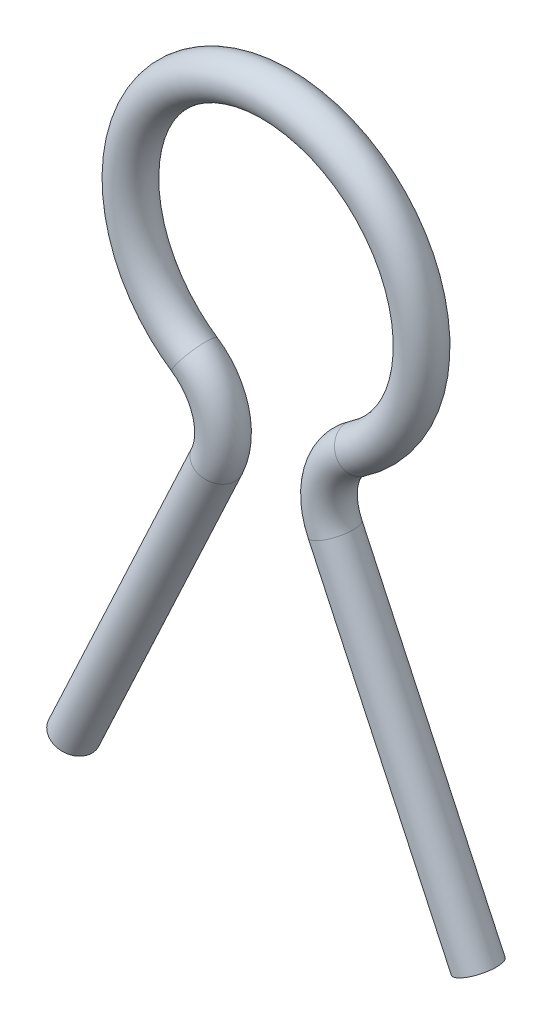
ISO-10303-21;
HEADER;
FILE_DESCRIPTION(('STEP AP214'),'2;1');
FILE_NAME('part.step','',(''),(''),'','','');
FILE_SCHEMA(('AUTOMOTIVE_DESIGN { 1 0 10303 214 1 1 1 1 }'));
ENDSEC;
DATA;
#1=APPLICATION_CONTEXT('core data for automotive mechanical design processes');
#2=APPLICATION_PROTOCOL_DEFINITION('international standard','automotive_design',2000,#1);
#3=PRODUCT_CONTEXT('',#1,'mechanical');
#4=PRODUCT('Part','Part','',(#3));
#5=PRODUCT_RELATED_PRODUCT_CATEGORY('part','',(#4));
#6=PRODUCT_DEFINITION_FORMATION('','',#4);
#7=PRODUCT_DEFINITION_CONTEXT('part definition',#1,'design');
#8=PRODUCT_DEFINITION('design','',#6,#7);
#9=PRODUCT_DEFINITION_SHAPE('','',#8);
#10=(LENGTH_UNIT() NAMED_UNIT(*) SI_UNIT(.MILLI.,.METRE.));
#11=(NAMED_UNIT(*) PLANE_ANGLE_UNIT() SI_UNIT($,.RADIAN.));
#12=(NAMED_UNIT(*) SI_UNIT($,.STERADIAN.) SOLID_ANGLE_UNIT());
#13=UNCERTAINTY_MEASURE_WITH_UNIT(LENGTH_MEASURE(1.E-05),#10,'distance_accuracy_value','');
#14=(GEOMETRIC_REPRESENTATION_CONTEXT(3) GLOBAL_UNCERTAINTY_ASSIGNED_CONTEXT((#13)) GLOBAL_UNIT_ASSIGNED_CONTEXT((#10,
#11,#12)) REPRESENTATION_CONTEXT('',''));
#15=CARTESIAN_POINT('',(0.,0.,0.));
#16=DIRECTION('',(0.,0.,1.));
#17=DIRECTION('',(1.,0.,0.));
#18=AXIS2_PLACEMENT_3D('',#15,#16,#17);
#19=CARTESIAN_POINT('',(0.,0.,0.));
#20=DIRECTION('',(-0.422618261740694,0.906307787036652,0.));
#21=DIRECTION('',(-0.906307787036652,-0.422618261740694,0.));
#22=AXIS2_PLACEMENT_3D('',#19,#20,#21);
#23=PLANE('',#22);
#24=CARTESIAN_POINT('',(0.,0.,0.));
#25=DIRECTION('',(-0.422618261740694,0.906307787036652,0.));
#26=DIRECTION('',(-0.906307787036652,-0.422618261740694,0.));
#27=AXIS2_PLACEMENT_3D('',#24,#25,#26);
#28=CIRCLE('',#27,0.7874);
#29=CARTESIAN_POINT('',(-0.71362675151266,-0.332769619294623,0.));
#30=VERTEX_POINT('',#29);
#31=EDGE_CURVE('E54',#30,#30,#28,.T.);
#32=ORIENTED_EDGE('',*,*,#31,.F.);
#33=EDGE_LOOP('',(#32));
#34=FACE_BOUND('',#33,.T.);
#35=ADVANCED_FACE('F32',(#34),#23,.F.);
#36=CARTESIAN_POINT('',(-15.8749999999997,0.,0.));
#37=DIRECTION('',(-0.4226182617407,-0.906307787036649,0.));
#38=DIRECTION('',(0.906307787036649,-0.4226182617407,0.));
#39=AXIS2_PLACEMENT_3D('',#36,#37,#38);
#40=PLANE('',#39);
#41=CARTESIAN_POINT('',(-15.8749999999997,0.,0.));
#42=DIRECTION('',(-0.4226182617407,-0.906307787036649,0.));
#43=DIRECTION('',(0.906307787036649,-0.4226182617407,0.));
#44=AXIS2_PLACEMENT_3D('',#41,#42,#43);
#45=CIRCLE('',#44,0.7874);
#46=CARTESIAN_POINT('',(-15.161373248487,-0.332769619294624,0.));
#47=VERTEX_POINT('',#46);
#48=EDGE_CURVE('E10',#47,#47,#45,.T.);
#49=ORIENTED_EDGE('',*,*,#48,.T.);
#50=EDGE_LOOP('',(#49));
#51=FACE_BOUND('',#50,.T.);
#52=ADVANCED_FACE('F61',(#51),#40,.T.);
#53=CARTESIAN_POINT('',(0.,0.,0.));
#54=DIRECTION('',(-0.422618261740694,0.906307787036652,0.));
#55=DIRECTION('',(-0.906307787036653,-0.422618261740694,0.));
#56=AXIS2_PLACEMENT_3D('',#53,#54,#55);
#57=CYLINDRICAL_SURFACE('',#56,0.7874);
#58=CARTESIAN_POINT('',(-5.62072660589347,12.0536871046309,0.));
#59=DIRECTION('',(-0.422618261740694,0.906307787036652,0.));
#60=DIRECTION('',(-0.906307787036652,-0.422618261740694,0.));
#61=AXIS2_PLACEMENT_3D('',#58,#59,#60);
#62=CIRCLE('',#61,0.7874);
#63=CARTESIAN_POINT('',(-6.33435335740613,11.7209174853363,0.));
#64=VERTEX_POINT('',#63);
#65=EDGE_CURVE('E51',#64,#64,#62,.T.);
#66=ORIENTED_EDGE('',*,*,#65,.F.);
#67=EDGE_LOOP('',(#66));
#68=FACE_BOUND('',#67,.T.);
#69=ORIENTED_EDGE('',*,*,#31,.T.);
#70=EDGE_LOOP('',(#69));
#71=FACE_BOUND('',#70,.T.);
#72=ADVANCED_FACE('F58',(#68,#71),#57,.T.);
#73=CARTESIAN_POINT('',(-3.31870482682037,13.1271374894523,0.));
#74=DIRECTION('',(0.,0.,-1.));
#75=DIRECTION('',(-1.,0.,0.));
#76=AXIS2_PLACEMENT_3D('',#73,#74,#75);
#77=TOROIDAL_SURFACE('',#76,2.54,0.7874);
#78=CARTESIAN_POINT('',(-4.73987257241405,15.2323410992925,0.));
#79=DIRECTION('',(0.828820318834721,0.559514860469953,0.));
#80=DIRECTION('',(-0.559514860469953,0.828820318834721,0.));
#81=AXIS2_PLACEMENT_3D('',#78,#79,#80);
#82=CIRCLE('',#81,0.7874);
#83=CARTESIAN_POINT('',(-5.18043457354809,15.884954218343,0.));
#84=VERTEX_POINT('',#83);
#85=EDGE_CURVE('E46',#84,#84,#82,.T.);
#86=CARTESIAN_POINT('',(-3.31870482682037,13.1271374894523,0.));
#87=DIRECTION('',(0.,0.,-1.));
#88=DIRECTION('',(-1.,0.,0.));
#89=AXIS2_PLACEMENT_3D('',#86,#87,#88);
#90=CIRCLE('',#89,3.3274);
#91=EDGE_CURVE('',#64,#84,#90,.T.);
#92=ORIENTED_EDGE('',*,*,#65,.T.);
#93=ORIENTED_EDGE('',*,*,#85,.F.);
#94=ORIENTED_EDGE('',*,*,#91,.T.);
#95=ORIENTED_EDGE('',*,*,#91,.F.);
#96=EDGE_LOOP('',(#92,#94,#93,#95));
#97=FACE_BOUND('',#96,.T.);
#98=ADVANCED_FACE('F79',(#97),#77,.T.);
#99=CARTESIAN_POINT('',(-7.93749999999981,19.9690492214329,0.));
#100=DIRECTION('',(0.,0.,1.));
#101=DIRECTION('',(1.,0.,0.));
#102=AXIS2_PLACEMENT_3D('',#99,#100,#101);
#103=TOROIDAL_SURFACE('',#102,5.71499999999998,0.7874);
#104=CARTESIAN_POINT('',(-11.1351274275856,15.2323410992925,0.));
#105=DIRECTION('',(0.828820318834724,-0.559514860469949,0.));
#106=DIRECTION('',(0.559514860469949,0.828820318834724,0.));
#107=AXIS2_PLACEMENT_3D('',#104,#105,#106);
#108=CIRCLE('',#107,0.7874);
#109=CARTESIAN_POINT('',(-10.6945654264515,15.8849542183429,0.));
#110=VERTEX_POINT('',#109);
#111=EDGE_CURVE('E42',#110,#110,#108,.T.);
#112=ORIENTED_EDGE('',*,*,#111,.F.);
#113=EDGE_LOOP('',(#112));
#114=FACE_BOUND('',#113,.T.);
#115=ORIENTED_EDGE('',*,*,#85,.T.);
#116=EDGE_LOOP('',(#115));
#117=FACE_BOUND('',#116,.T.);
#118=ADVANCED_FACE('F73',(#114,#117),#103,.T.);
#119=CARTESIAN_POINT('',(-12.5562951731792,13.1271374894522,0.));
#120=DIRECTION('',(0.,0.,-1.));
#121=DIRECTION('',(-1.,0.,0.));
#122=AXIS2_PLACEMENT_3D('',#119,#120,#121);
#123=TOROIDAL_SURFACE('',#122,2.54,0.7874);
#124=CARTESIAN_POINT('',(-10.2542733941061,12.0536871046309,0.));
#125=DIRECTION('',(-0.4226182617407,-0.906307787036649,0.));
#126=DIRECTION('',(0.906307787036649,-0.4226182617407,0.));
#127=AXIS2_PLACEMENT_3D('',#124,#125,#126);
#128=CIRCLE('',#127,0.7874);
#129=CARTESIAN_POINT('',(-9.54064664259349,11.7209174853362,0.));
#130=VERTEX_POINT('',#129);
#131=EDGE_CURVE('E38',#130,#130,#128,.T.);
#132=CARTESIAN_POINT('',(-12.5562951731792,13.1271374894522,0.));
#133=DIRECTION('',(0.,0.,-1.));
#134=DIRECTION('',(-1.,0.,0.));
#135=AXIS2_PLACEMENT_3D('',#132,#133,#134);
#136=CIRCLE('',#135,3.3274);
#137=EDGE_CURVE('',#110,#130,#136,.T.);
#138=ORIENTED_EDGE('',*,*,#111,.T.);
#139=ORIENTED_EDGE('',*,*,#131,.F.);
#140=ORIENTED_EDGE('',*,*,#137,.T.);
#141=ORIENTED_EDGE('',*,*,#137,.F.);
#142=EDGE_LOOP('',(#138,#140,#139,#141));
#143=FACE_BOUND('',#142,.T.);
#144=ADVANCED_FACE('F67',(#143),#123,.T.);
#145=CARTESIAN_POINT('',(-10.2542733941061,12.0536871046309,0.));
#146=DIRECTION('',(-0.4226182617407,-0.906307787036649,0.));
#147=DIRECTION('',(0.90630778703665,-0.4226182617407,0.));
#148=AXIS2_PLACEMENT_3D('',#145,#146,#147);
#149=CYLINDRICAL_SURFACE('',#148,0.7874);
#150=CARTESIAN_POINT('',(-15.161373248487,-0.332769619294624,0.));
#151=CARTESIAN_POINT('',(-15.102824013009,-0.207210378621386,0.));
#152=CARTESIAN_POINT('',(-15.0442747775309,-0.0816511379481484,0.));
#153=CARTESIAN_POINT('',(-14.9271763065748,0.169467343398328,0.));
#154=CARTESIAN_POINT('',(-14.8686270710967,0.295026584071566,0.));
#155=CARTESIAN_POINT('',(-14.7515286001406,0.546145065418043,0.));
#156=CARTESIAN_POINT('',(-14.6929793646626,0.671704306091282,0.));
#157=CARTESIAN_POINT('',(-14.5758808937065,0.922822787437758,0.));
#158=CARTESIAN_POINT('',(-14.5173316582284,1.048382028111,0.));
#159=CARTESIAN_POINT('',(-14.4002331872723,1.29950050945747,0.));
#160=CARTESIAN_POINT('',(-14.3416839517942,1.42505975013071,0.));
#161=CARTESIAN_POINT('',(-14.2245854808381,1.67617823147719,0.));
#162=CARTESIAN_POINT('',(-14.16603624536,1.80173747215042,0.));
#163=CARTESIAN_POINT('',(-14.0489377744039,2.0528559534969,0.));
#164=CARTESIAN_POINT('',(-13.9903885389259,2.17841519417014,0.));
#165=CARTESIAN_POINT('',(-13.8732900679698,2.42953367551661,0.));
#166=CARTESIAN_POINT('',(-13.8147408324917,2.55509291618985,0.));
#167=CARTESIAN_POINT('',(-13.6976423615356,2.80621139753633,0.));
#168=CARTESIAN_POINT('',(-13.6390931260575,2.93177063820957,0.));
#169=CARTESIAN_POINT('',(-13.5219946551014,3.18288911955604,0.));
#170=CARTESIAN_POINT('',(-13.4634454196234,3.30844836022928,0.));
#171=CARTESIAN_POINT('',(-13.3463469486672,3.55956684157576,0.));
#172=CARTESIAN_POINT('',(-13.2877977131892,3.685126082249,0.));
#173=CARTESIAN_POINT('',(-13.1706992422331,3.93624456359547,0.));
#174=CARTESIAN_POINT('',(-13.112150006755,4.06180380426871,0.));
#175=CARTESIAN_POINT('',(-12.9950515357989,4.31292228561519,0.));
#176=CARTESIAN_POINT('',(-12.9365023003208,4.43848152628843,0.));
#177=CARTESIAN_POINT('',(-12.8194038293647,4.6896000076349,0.));
#178=CARTESIAN_POINT('',(-12.7608545938867,4.81515924830814,0.));
#179=CARTESIAN_POINT('',(-12.6437561229305,5.06627772965462,0.));
#180=CARTESIAN_POINT('',(-12.5852068874525,5.19183697032785,0.));
#181=CARTESIAN_POINT('',(-12.4681084164964,5.44295545167433,0.));
#182=CARTESIAN_POINT('',(-12.4095591810183,5.56851469234757,0.));
#183=CARTESIAN_POINT('',(-12.2924607100622,5.81963317369404,0.));
#184=CARTESIAN_POINT('',(-12.2339114745841,5.94519241436728,0.));
#185=CARTESIAN_POINT('',(-12.116813003628,6.19631089571376,0.));
#186=CARTESIAN_POINT('',(-12.05826376815,6.321870136387,0.));
#187=CARTESIAN_POINT('',(-11.9411652971939,6.57298861773347,0.));
#188=CARTESIAN_POINT('',(-11.8826160617158,6.69854785840671,0.));
#189=CARTESIAN_POINT('',(-11.7655175907597,6.94966633975319,0.));
#190=CARTESIAN_POINT('',(-11.7069683552816,7.07522558042643,0.));
#191=CARTESIAN_POINT('',(-11.5898698843255,7.3263440617729,0.));
#192=CARTESIAN_POINT('',(-11.5313206488475,7.45190330244614,0.));
#193=CARTESIAN_POINT('',(-11.4142221778913,7.70302178379262,0.));
#194=CARTESIAN_POINT('',(-11.3556729424133,7.82858102446586,0.));
#195=CARTESIAN_POINT('',(-11.2385744714572,8.07969950581233,0.));
#196=CARTESIAN_POINT('',(-11.1800252359791,8.20525874648557,0.));
#197=CARTESIAN_POINT('',(-11.062926765023,8.45637722783205,0.));
#198=CARTESIAN_POINT('',(-11.0043775295449,8.58193646850528,0.));
#199=CARTESIAN_POINT('',(-10.8872790585888,8.83305494985176,0.));
#200=CARTESIAN_POINT('',(-10.8287298231108,8.958614190525,0.));
#201=CARTESIAN_POINT('',(-10.7116313521546,9.20973267187147,0.));
#202=CARTESIAN_POINT('',(-10.6530821166766,9.33529191254471,0.));
#203=CARTESIAN_POINT('',(-10.5359836457205,9.58641039389119,0.));
#204=CARTESIAN_POINT('',(-10.4774344102424,9.71196963456443,0.));
#205=CARTESIAN_POINT('',(-10.3603359392863,9.9630881159109,0.));
#206=CARTESIAN_POINT('',(-10.3017867038082,10.0886473565841,0.));
#207=CARTESIAN_POINT('',(-10.1846882328521,10.3397658379306,0.));
#208=CARTESIAN_POINT('',(-10.1261389973741,10.4653250786039,0.));
#209=CARTESIAN_POINT('',(-10.009040526418,10.7164435599503,0.));
#210=CARTESIAN_POINT('',(-9.95049129093989,10.8420028006236,0.));
#211=CARTESIAN_POINT('',(-9.83339281998378,11.09312128197,0.));
#212=CARTESIAN_POINT('',(-9.77484358450572,11.2186805226433,0.));
#213=CARTESIAN_POINT('',(-9.65774511354961,11.4697990039898,0.));
#214=CARTESIAN_POINT('',(-9.59919587807155,11.595358244663,0.));
#215=CARTESIAN_POINT('',(-9.54064664259349,11.7209174853362,0.));
#216=B_SPLINE_CURVE_WITH_KNOTS('',3,(#150,#151,#152,#153,#154,#155,#156,#157,#158,#159,#160,
#161,#162,#163,#164,#165,#166,#167,#168,#169,#170,#171,#172,#173,#174,#175,#176,#177,#178,#179,
#180,#181,#182,#183,#184,#185,#186,#187,#188,#189,#190,#191,#192,#193,#194,#195,#196,#197,#198,
#199,#200,#201,#202,#203,#204,#205,#206,#207,#208,#209,#210,#211,#212,#213,#214,#215),
.UNSPECIFIED.,.F.,.F.,(4,2,2,2,2,2,2,2,2,2,2,2,2,2,2,2,2,2,2,2,2,2,2,2,2,2,2,2,2,2,2,2,4),(0.,
0.415617881041644,0.83123576208329,1.24685364312494,1.66247152416658,2.07808940520822,
2.49370728624987,2.90932516729151,3.32494304833316,3.7405609293748,4.15617881041645,
4.57179669145809,4.98741457249974,5.40303245354138,5.81865033458303,6.23426821562467,
6.64988609666631,7.06550397770796,7.4811218587496,7.89673973979125,8.31235762083289,
8.72797550187454,9.14359338291618,9.55921126395783,9.97482914499947,10.3904470260411,
10.8060649070828,11.2216827881244,11.6373006691661,12.0529185502077,12.4685364312493,
12.884154312291,13.2997721933326),.UNSPECIFIED.);
#217=EDGE_CURVE('BSEAM65',#47,#130,#216,.T.);
#218=ORIENTED_EDGE('',*,*,#48,.F.);
#219=ORIENTED_EDGE('',*,*,#131,.T.);
#220=ORIENTED_EDGE('',*,*,#217,.T.);
#221=ORIENTED_EDGE('',*,*,#217,.F.);
#222=EDGE_LOOP('',(#218,#220,#219,#221));
#223=FACE_BOUND('',#222,.T.);
#224=ADVANCED_FACE('F65',(#223),#149,.T.);
#225=CLOSED_SHELL('',(#35,#52,#72,#98,#118,#144,#224));
#226=MANIFOLD_SOLID_BREP('B2',#225);
#227=ADVANCED_BREP_SHAPE_REPRESENTATION('',(#18,#226),#14);
#228=SHAPE_DEFINITION_REPRESENTATION(#9,#227);
ENDSEC;
END-ISO-10303-21;
